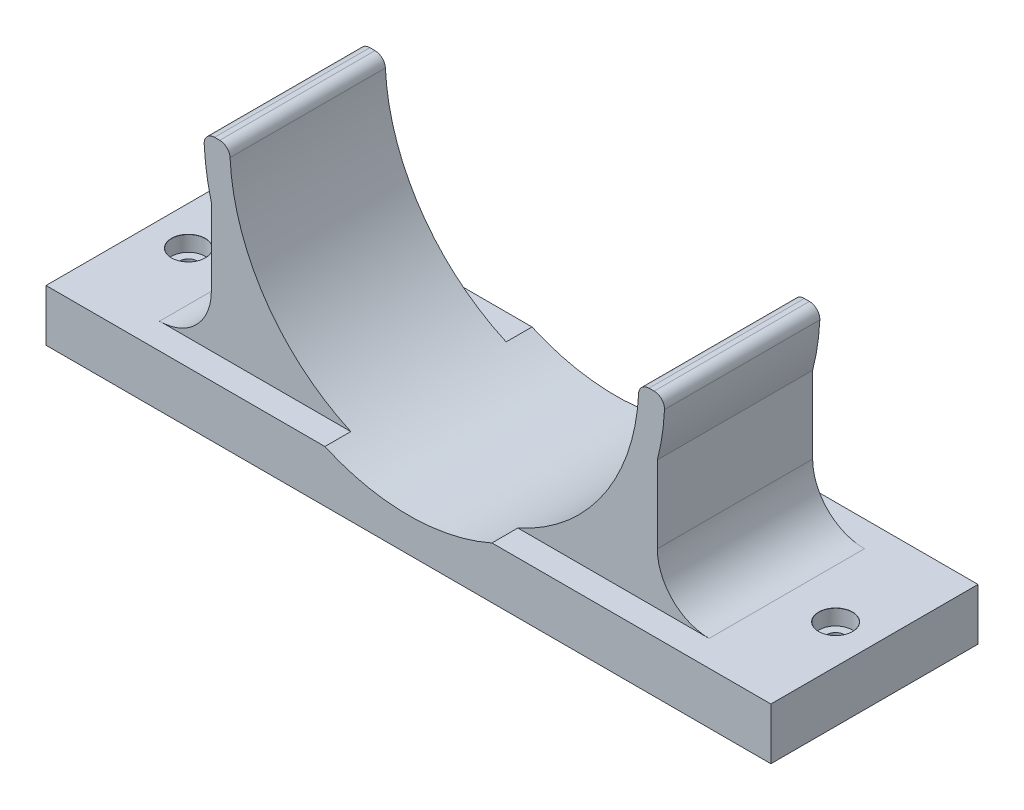
ISO-10303-21;
HEADER;
FILE_DESCRIPTION(('STEP AP214'),'2;1');
FILE_NAME('part.step','',(''),(''),'','','');
FILE_SCHEMA(('AUTOMOTIVE_DESIGN { 1 0 10303 214 1 1 1 1 }'));
ENDSEC;
DATA;
#1=APPLICATION_CONTEXT('core data for automotive mechanical design processes');
#2=APPLICATION_PROTOCOL_DEFINITION('international standard','automotive_design',2000,#1);
#3=PRODUCT_CONTEXT('',#1,'mechanical');
#4=PRODUCT('Part','Part','',(#3));
#5=PRODUCT_RELATED_PRODUCT_CATEGORY('part','',(#4));
#6=PRODUCT_DEFINITION_FORMATION('','',#4);
#7=PRODUCT_DEFINITION_CONTEXT('part definition',#1,'design');
#8=PRODUCT_DEFINITION('design','',#6,#7);
#9=PRODUCT_DEFINITION_SHAPE('','',#8);
#10=(LENGTH_UNIT() NAMED_UNIT(*) SI_UNIT(.MILLI.,.METRE.));
#11=(NAMED_UNIT(*) PLANE_ANGLE_UNIT() SI_UNIT($,.RADIAN.));
#12=(NAMED_UNIT(*) SI_UNIT($,.STERADIAN.) SOLID_ANGLE_UNIT());
#13=UNCERTAINTY_MEASURE_WITH_UNIT(LENGTH_MEASURE(1.E-05),#10,'distance_accuracy_value','');
#14=(GEOMETRIC_REPRESENTATION_CONTEXT(3) GLOBAL_UNCERTAINTY_ASSIGNED_CONTEXT((#13)) GLOBAL_UNIT_ASSIGNED_CONTEXT((#10,
#11,#12)) REPRESENTATION_CONTEXT('',''));
#15=CARTESIAN_POINT('',(0.,0.,0.));
#16=DIRECTION('',(0.,0.,1.));
#17=DIRECTION('',(1.,0.,0.));
#18=AXIS2_PLACEMENT_3D('',#15,#16,#17);
#19=CARTESIAN_POINT('',(0.,-36.056178761089,-20.));
#20=DIRECTION('',(0.,-1.,0.));
#21=DIRECTION('',(0.,0.,-1.));
#22=AXIS2_PLACEMENT_3D('',#19,#20,#21);
#23=PLANE('',#22);
#24=CARTESIAN_POINT('',(-62.5,-36.056178761089,0.));
#25=DIRECTION('',(0.,1.,0.));
#26=DIRECTION('',(0.,0.,1.));
#27=AXIS2_PLACEMENT_3D('',#24,#25,#26);
#28=CIRCLE('',#27,3.275);
#29=CARTESIAN_POINT('',(-62.5,-36.056178761089,3.275));
#30=VERTEX_POINT('',#29);
#31=EDGE_CURVE('E858',#30,#30,#28,.T.);
#32=ORIENTED_EDGE('',*,*,#31,.F.);
#33=EDGE_LOOP('',(#32));
#34=FACE_BOUND('',#33,.T.);
#35=DIRECTION('',(1.,0.,0.));
#36=VECTOR('',#35,1.);
#37=CARTESIAN_POINT('',(0.,-36.056178761089,15.));
#38=LINE('',#37,#36);
#39=CARTESIAN_POINT('',(-53.0653886011214,-36.056178761089,15.));
#40=VERTEX_POINT('',#39);
#41=CARTESIAN_POINT('',(-16.1307772022429,-36.056178761089,15.));
#42=VERTEX_POINT('',#41);
#43=EDGE_CURVE('E209',#40,#42,#38,.T.);
#44=ORIENTED_EDGE('',*,*,#43,.F.);
#45=DIRECTION('',(0.,0.,1.));
#46=VECTOR('',#45,1.);
#47=CARTESIAN_POINT('',(-53.0653886011214,-36.056178761089,-15.));
#48=LINE('',#47,#46);
#49=CARTESIAN_POINT('',(-53.0653886011214,-36.056178761089,-15.));
#50=VERTEX_POINT('',#49);
#51=EDGE_CURVE('E366',#40,#50,#48,.F.);
#52=ORIENTED_EDGE('',*,*,#51,.T.);
#53=DIRECTION('',(1.,0.,0.));
#54=VECTOR('',#53,1.);
#55=CARTESIAN_POINT('',(0.,-36.056178761089,-15.));
#56=LINE('',#55,#54);
#57=CARTESIAN_POINT('',(-16.1307772022429,-36.056178761089,-15.));
#58=VERTEX_POINT('',#57);
#59=EDGE_CURVE('E284',#50,#58,#56,.T.);
#60=ORIENTED_EDGE('',*,*,#59,.T.);
#61=DIRECTION('',(0.,0.,1.));
#62=VECTOR('',#61,1.);
#63=CARTESIAN_POINT('',(-16.1307772022429,-36.056178761089,-20.));
#64=LINE('',#63,#62);
#65=CARTESIAN_POINT('',(-16.1307772022429,-36.056178761089,-20.));
#66=VERTEX_POINT('',#65);
#67=EDGE_CURVE('E354',#66,#58,#64,.T.);
#68=ORIENTED_EDGE('',*,*,#67,.F.);
#69=DIRECTION('',(1.,0.,0.));
#70=VECTOR('',#69,1.);
#71=CARTESIAN_POINT('',(0.,-36.056178761089,-20.));
#72=LINE('',#71,#70);
#73=CARTESIAN_POINT('',(-70.,-36.056178761089,-20.));
#74=VERTEX_POINT('',#73);
#75=EDGE_CURVE('E319',#74,#66,#72,.T.);
#76=ORIENTED_EDGE('',*,*,#75,.F.);
#77=DIRECTION('',(0.,0.,1.));
#78=VECTOR('',#77,1.);
#79=CARTESIAN_POINT('',(-70.,-36.056178761089,-20.));
#80=LINE('',#79,#78);
#81=CARTESIAN_POINT('',(-70.,-36.056178761089,20.));
#82=VERTEX_POINT('',#81);
#83=EDGE_CURVE('E351',#74,#82,#80,.T.);
#84=ORIENTED_EDGE('',*,*,#83,.T.);
#85=DIRECTION('',(1.,0.,0.));
#86=VECTOR('',#85,1.);
#87=CARTESIAN_POINT('',(0.,-36.056178761089,20.));
#88=LINE('',#87,#86);
#89=CARTESIAN_POINT('',(-16.1307772022429,-36.056178761089,20.));
#90=VERTEX_POINT('',#89);
#91=EDGE_CURVE('E295',#82,#90,#88,.T.);
#92=ORIENTED_EDGE('',*,*,#91,.T.);
#93=EDGE_CURVE('E336',#42,#90,#64,.T.);
#94=ORIENTED_EDGE('',*,*,#93,.F.);
#95=EDGE_LOOP('',(#44,#52,#60,#68,#76,#84,#92,#94));
#96=FACE_BOUND('',#95,.T.);
#97=ADVANCED_FACE('F47',(#34,#96),#23,.F.);
#98=CARTESIAN_POINT('',(0.,0.,-15.));
#99=DIRECTION('',(0.,0.,1.));
#100=DIRECTION('',(1.,0.,0.));
#101=AXIS2_PLACEMENT_3D('',#98,#99,#100);
#102=CYLINDRICAL_SURFACE('',#101,44.5);
#103=CARTESIAN_POINT('',(0.,0.,15.));
#104=DIRECTION('',(0.,0.,1.));
#105=DIRECTION('',(1.,0.,0.));
#106=AXIS2_PLACEMENT_3D('',#103,#104,#105);
#107=CIRCLE('',#106,44.5);
#108=CARTESIAN_POINT('',(-44.4506993339844,-2.09411764705882,15.));
#109=VERTEX_POINT('',#108);
#110=CARTESIAN_POINT('',(-43.0653886011214,-11.2081356448965,15.));
#111=VERTEX_POINT('',#110);
#112=EDGE_CURVE('E198',#109,#111,#107,.T.);
#113=ORIENTED_EDGE('',*,*,#112,.F.);
#114=DIRECTION('',(0.,0.,1.));
#115=VECTOR('',#114,1.);
#116=CARTESIAN_POINT('',(-44.4506993339844,-2.09411764705882,-15.));
#117=LINE('',#116,#115);
#118=CARTESIAN_POINT('',(-44.4506993339844,-2.09411764705882,-15.));
#119=VERTEX_POINT('',#118);
#120=EDGE_CURVE('E395',#109,#119,#117,.F.);
#121=ORIENTED_EDGE('',*,*,#120,.T.);
#122=CARTESIAN_POINT('',(0.,0.,-15.));
#123=DIRECTION('',(0.,0.,1.));
#124=DIRECTION('',(1.,0.,0.));
#125=AXIS2_PLACEMENT_3D('',#122,#123,#124);
#126=CIRCLE('',#125,44.5);
#127=CARTESIAN_POINT('',(-43.0653886011214,-11.2081356448965,-15.));
#128=VERTEX_POINT('',#127);
#129=EDGE_CURVE('E226',#119,#128,#126,.T.);
#130=ORIENTED_EDGE('',*,*,#129,.T.);
#131=DIRECTION('',(0.,0.,1.));
#132=VECTOR('',#131,1.);
#133=CARTESIAN_POINT('',(-43.0653886011214,-11.2081356448965,-15.));
#134=LINE('',#133,#132);
#135=EDGE_CURVE('E217',#128,#111,#134,.T.);
#136=ORIENTED_EDGE('',*,*,#135,.T.);
#137=EDGE_LOOP('',(#113,#121,#130,#136));
#138=FACE_BOUND('',#137,.T.);
#139=ADVANCED_FACE('F224',(#138),#102,.T.);
#140=CARTESIAN_POINT('',(0.,-36.056178761089,-20.));
#141=DIRECTION('',(0.,-1.,0.));
#142=DIRECTION('',(0.,0.,-1.));
#143=AXIS2_PLACEMENT_3D('',#140,#141,#142);
#144=PLANE('',#143);
#145=CARTESIAN_POINT('',(62.5,-36.056178761089,0.));
#146=DIRECTION('',(0.,1.,0.));
#147=DIRECTION('',(0.,0.,1.));
#148=AXIS2_PLACEMENT_3D('',#145,#146,#147);
#149=CIRCLE('',#148,3.275);
#150=CARTESIAN_POINT('',(62.5,-36.056178761089,3.275));
#151=VERTEX_POINT('',#150);
#152=EDGE_CURVE('E816',#151,#151,#149,.T.);
#153=ORIENTED_EDGE('',*,*,#152,.F.);
#154=EDGE_LOOP('',(#153));
#155=FACE_BOUND('',#154,.T.);
#156=DIRECTION('',(0.,0.,1.));
#157=VECTOR('',#156,1.);
#158=CARTESIAN_POINT('',(53.0653886011214,-36.056178761089,-20.));
#159=LINE('',#158,#157);
#160=CARTESIAN_POINT('',(53.0653886011214,-36.056178761089,-15.));
#161=VERTEX_POINT('',#160);
#162=CARTESIAN_POINT('',(53.0653886011214,-36.056178761089,15.));
#163=VERTEX_POINT('',#162);
#164=EDGE_CURVE('E340',#161,#163,#159,.T.);
#165=ORIENTED_EDGE('',*,*,#164,.T.);
#166=DIRECTION('',(1.,0.,0.));
#167=VECTOR('',#166,1.);
#168=CARTESIAN_POINT('',(0.,-36.056178761089,15.));
#169=LINE('',#168,#167);
#170=CARTESIAN_POINT('',(16.1307772022429,-36.056178761089,15.));
#171=VERTEX_POINT('',#170);
#172=EDGE_CURVE('E256',#171,#163,#169,.T.);
#173=ORIENTED_EDGE('',*,*,#172,.F.);
#174=DIRECTION('',(0.,0.,1.));
#175=VECTOR('',#174,1.);
#176=CARTESIAN_POINT('',(16.1307772022429,-36.056178761089,-20.));
#177=LINE('',#176,#175);
#178=CARTESIAN_POINT('',(16.1307772022429,-36.056178761089,20.));
#179=VERTEX_POINT('',#178);
#180=EDGE_CURVE('E341',#171,#179,#177,.T.);
#181=ORIENTED_EDGE('',*,*,#180,.T.);
#182=DIRECTION('',(1.,0.,0.));
#183=VECTOR('',#182,1.);
#184=CARTESIAN_POINT('',(0.,-36.056178761089,20.));
#185=LINE('',#184,#183);
#186=CARTESIAN_POINT('',(70.,-36.056178761089,20.));
#187=VERTEX_POINT('',#186);
#188=EDGE_CURVE('E311',#179,#187,#185,.T.);
#189=ORIENTED_EDGE('',*,*,#188,.T.);
#190=DIRECTION('',(0.,0.,1.));
#191=VECTOR('',#190,1.);
#192=CARTESIAN_POINT('',(70.,-36.056178761089,-20.));
#193=LINE('',#192,#191);
#194=CARTESIAN_POINT('',(70.,-36.056178761089,-20.));
#195=VERTEX_POINT('',#194);
#196=EDGE_CURVE('E342',#195,#187,#193,.T.);
#197=ORIENTED_EDGE('',*,*,#196,.F.);
#198=DIRECTION('',(1.,0.,0.));
#199=VECTOR('',#198,1.);
#200=CARTESIAN_POINT('',(0.,-36.056178761089,-20.));
#201=LINE('',#200,#199);
#202=CARTESIAN_POINT('',(16.1307772022429,-36.056178761089,-20.));
#203=VERTEX_POINT('',#202);
#204=EDGE_CURVE('E333',#203,#195,#201,.T.);
#205=ORIENTED_EDGE('',*,*,#204,.F.);
#206=CARTESIAN_POINT('',(16.1307772022429,-36.056178761089,-15.));
#207=VERTEX_POINT('',#206);
#208=EDGE_CURVE('E337',#203,#207,#177,.T.);
#209=ORIENTED_EDGE('',*,*,#208,.T.);
#210=DIRECTION('',(1.,0.,0.));
#211=VECTOR('',#210,1.);
#212=CARTESIAN_POINT('',(0.,-36.056178761089,-15.));
#213=LINE('',#212,#211);
#214=EDGE_CURVE('E243',#207,#161,#213,.T.);
#215=ORIENTED_EDGE('',*,*,#214,.T.);
#216=EDGE_LOOP('',(#165,#173,#181,#189,#197,#205,#209,#215));
#217=FACE_BOUND('',#216,.T.);
#218=ADVANCED_FACE('F461',(#155,#217),#144,.F.);
#219=CARTESIAN_POINT('',(0.,0.,-20.));
#220=DIRECTION('',(0.,0.,1.));
#221=DIRECTION('',(1.,0.,0.));
#222=AXIS2_PLACEMENT_3D('',#219,#220,#221);
#223=CYLINDRICAL_SURFACE('',#222,39.5);
#224=CARTESIAN_POINT('',(0.,0.,-15.));
#225=DIRECTION('',(0.,0.,1.));
#226=DIRECTION('',(1.,0.,0.));
#227=AXIS2_PLACEMENT_3D('',#224,#225,#226);
#228=CIRCLE('',#227,39.5);
#229=CARTESIAN_POINT('',(-39.45410310723,-1.90361445783133,-15.));
#230=VERTEX_POINT('',#229);
#231=EDGE_CURVE('E288',#230,#58,#228,.T.);
#232=ORIENTED_EDGE('',*,*,#231,.F.);
#233=DIRECTION('',(0.,0.,1.));
#234=VECTOR('',#233,1.);
#235=CARTESIAN_POINT('',(-39.45410310723,-1.90361445783133,-20.));
#236=LINE('',#235,#234);
#237=CARTESIAN_POINT('',(-39.45410310723,-1.90361445783133,15.));
#238=VERTEX_POINT('',#237);
#239=EDGE_CURVE('E408',#230,#238,#236,.T.);
#240=ORIENTED_EDGE('',*,*,#239,.T.);
#241=CARTESIAN_POINT('',(0.,0.,15.));
#242=DIRECTION('',(0.,0.,1.));
#243=DIRECTION('',(1.,0.,0.));
#244=AXIS2_PLACEMENT_3D('',#241,#242,#243);
#245=CIRCLE('',#244,39.5);
#246=EDGE_CURVE('E275',#238,#42,#245,.T.);
#247=ORIENTED_EDGE('',*,*,#246,.T.);
#248=ORIENTED_EDGE('',*,*,#93,.T.);
#249=CARTESIAN_POINT('',(0.,0.,20.));
#250=DIRECTION('',(0.,0.,1.));
#251=DIRECTION('',(1.,0.,0.));
#252=AXIS2_PLACEMENT_3D('',#249,#250,#251);
#253=CIRCLE('',#252,39.5);
#254=EDGE_CURVE('E291',#90,#179,#253,.T.);
#255=ORIENTED_EDGE('',*,*,#254,.T.);
#256=ORIENTED_EDGE('',*,*,#180,.F.);
#257=CARTESIAN_POINT('',(0.,0.,15.));
#258=DIRECTION('',(0.,0.,1.));
#259=DIRECTION('',(1.,0.,0.));
#260=AXIS2_PLACEMENT_3D('',#257,#258,#259);
#261=CIRCLE('',#260,39.5);
#262=CARTESIAN_POINT('',(39.45410310723,-1.90361445783133,15.));
#263=VERTEX_POINT('',#262);
#264=EDGE_CURVE('E266',#171,#263,#261,.T.);
#265=ORIENTED_EDGE('',*,*,#264,.T.);
#266=DIRECTION('',(0.,0.,1.));
#267=VECTOR('',#266,1.);
#268=CARTESIAN_POINT('',(39.45410310723,-1.90361445783133,-20.));
#269=LINE('',#268,#267);
#270=CARTESIAN_POINT('',(39.45410310723,-1.90361445783133,-15.));
#271=VERTEX_POINT('',#270);
#272=EDGE_CURVE('E404',#263,#271,#269,.F.);
#273=ORIENTED_EDGE('',*,*,#272,.T.);
#274=CARTESIAN_POINT('',(0.,0.,-15.));
#275=DIRECTION('',(0.,0.,1.));
#276=DIRECTION('',(1.,0.,0.));
#277=AXIS2_PLACEMENT_3D('',#274,#275,#276);
#278=CIRCLE('',#277,39.5);
#279=EDGE_CURVE('E252',#207,#271,#278,.T.);
#280=ORIENTED_EDGE('',*,*,#279,.F.);
#281=ORIENTED_EDGE('',*,*,#208,.F.);
#282=CARTESIAN_POINT('',(0.,0.,-20.));
#283=DIRECTION('',(0.,0.,1.));
#284=DIRECTION('',(1.,0.,0.));
#285=AXIS2_PLACEMENT_3D('',#282,#283,#284);
#286=CIRCLE('',#285,39.5);
#287=EDGE_CURVE('E315',#66,#203,#286,.T.);
#288=ORIENTED_EDGE('',*,*,#287,.F.);
#289=ORIENTED_EDGE('',*,*,#67,.T.);
#290=EDGE_LOOP('',(#232,#240,#247,#248,#255,#256,#265,#273,#280,#281,#288,#289));
#291=FACE_BOUND('',#290,.T.);
#292=ADVANCED_FACE('F437',(#291),#223,.F.);
#293=CARTESIAN_POINT('',(70.,0.,-20.));
#294=DIRECTION('',(-1.,0.,0.));
#295=DIRECTION('',(0.,0.,1.));
#296=AXIS2_PLACEMENT_3D('',#293,#294,#295);
#297=PLANE('',#296);
#298=ORIENTED_EDGE('',*,*,#196,.T.);
#299=DIRECTION('',(0.,-1.,0.));
#300=VECTOR('',#299,1.);
#301=CARTESIAN_POINT('',(70.,0.,20.));
#302=LINE('',#301,#300);
#303=CARTESIAN_POINT('',(70.,-46.056178761089,20.));
#304=VERTEX_POINT('',#303);
#305=EDGE_CURVE('E307',#187,#304,#302,.T.);
#306=ORIENTED_EDGE('',*,*,#305,.T.);
#307=DIRECTION('',(0.,0.,1.));
#308=VECTOR('',#307,1.);
#309=CARTESIAN_POINT('',(70.,-46.056178761089,-20.));
#310=LINE('',#309,#308);
#311=CARTESIAN_POINT('',(70.,-46.056178761089,-20.));
#312=VERTEX_POINT('',#311);
#313=EDGE_CURVE('E345',#312,#304,#310,.T.);
#314=ORIENTED_EDGE('',*,*,#313,.F.);
#315=DIRECTION('',(0.,-1.,0.));
#316=VECTOR('',#315,1.);
#317=CARTESIAN_POINT('',(70.,0.,-20.));
#318=LINE('',#317,#316);
#319=EDGE_CURVE('E330',#195,#312,#318,.T.);
#320=ORIENTED_EDGE('',*,*,#319,.F.);
#321=EDGE_LOOP('',(#298,#306,#314,#320));
#322=FACE_BOUND('',#321,.T.);
#323=ADVANCED_FACE('F504',(#322),#297,.F.);
#324=CARTESIAN_POINT('',(0.,-46.056178761089,-20.));
#325=DIRECTION('',(0.,-1.,0.));
#326=DIRECTION('',(0.,0.,-1.));
#327=AXIS2_PLACEMENT_3D('',#324,#325,#326);
#328=PLANE('',#327);
#329=CARTESIAN_POINT('',(-62.5,-46.056178761089,0.));
#330=DIRECTION('',(0.,1.,0.));
#331=DIRECTION('',(0.,0.,1.));
#332=AXIS2_PLACEMENT_3D('',#329,#330,#331);
#333=CIRCLE('',#332,1.7);
#334=CARTESIAN_POINT('',(-62.5,-46.056178761089,1.7));
#335=VERTEX_POINT('',#334);
#336=EDGE_CURVE('E820',#335,#335,#333,.T.);
#337=ORIENTED_EDGE('',*,*,#336,.T.);
#338=EDGE_LOOP('',(#337));
#339=FACE_BOUND('',#338,.T.);
#340=CARTESIAN_POINT('',(62.5,-46.056178761089,0.));
#341=DIRECTION('',(0.,1.,0.));
#342=DIRECTION('',(0.,0.,1.));
#343=AXIS2_PLACEMENT_3D('',#340,#341,#342);
#344=CIRCLE('',#343,1.69999999999999);
#345=CARTESIAN_POINT('',(62.5,-46.056178761089,1.69999999999999));
#346=VERTEX_POINT('',#345);
#347=EDGE_CURVE('E222',#346,#346,#344,.T.);
#348=ORIENTED_EDGE('',*,*,#347,.T.);
#349=EDGE_LOOP('',(#348));
#350=FACE_BOUND('',#349,.T.);
#351=ORIENTED_EDGE('',*,*,#313,.T.);
#352=DIRECTION('',(1.,0.,0.));
#353=VECTOR('',#352,1.);
#354=CARTESIAN_POINT('',(0.,-46.056178761089,20.));
#355=LINE('',#354,#353);
#356=CARTESIAN_POINT('',(-70.,-46.056178761089,20.));
#357=VERTEX_POINT('',#356);
#358=EDGE_CURVE('E303',#357,#304,#355,.T.);
#359=ORIENTED_EDGE('',*,*,#358,.F.);
#360=DIRECTION('',(0.,0.,1.));
#361=VECTOR('',#360,1.);
#362=CARTESIAN_POINT('',(-70.,-46.056178761089,-20.));
#363=LINE('',#362,#361);
#364=CARTESIAN_POINT('',(-70.,-46.056178761089,-20.));
#365=VERTEX_POINT('',#364);
#366=EDGE_CURVE('E348',#365,#357,#363,.T.);
#367=ORIENTED_EDGE('',*,*,#366,.F.);
#368=DIRECTION('',(1.,0.,0.));
#369=VECTOR('',#368,1.);
#370=CARTESIAN_POINT('',(0.,-46.056178761089,-20.));
#371=LINE('',#370,#369);
#372=EDGE_CURVE('E326',#365,#312,#371,.T.);
#373=ORIENTED_EDGE('',*,*,#372,.T.);
#374=EDGE_LOOP('',(#351,#359,#367,#373));
#375=FACE_BOUND('',#374,.T.);
#376=ADVANCED_FACE('F510',(#339,#350,#375),#328,.T.);
#377=CARTESIAN_POINT('',(-70.,0.,-20.));
#378=DIRECTION('',(-1.,0.,0.));
#379=DIRECTION('',(0.,0.,1.));
#380=AXIS2_PLACEMENT_3D('',#377,#378,#379);
#381=PLANE('',#380);
#382=ORIENTED_EDGE('',*,*,#366,.T.);
#383=DIRECTION('',(0.,-1.,0.));
#384=VECTOR('',#383,1.);
#385=CARTESIAN_POINT('',(-70.,0.,20.));
#386=LINE('',#385,#384);
#387=EDGE_CURVE('E299',#82,#357,#386,.T.);
#388=ORIENTED_EDGE('',*,*,#387,.F.);
#389=ORIENTED_EDGE('',*,*,#83,.F.);
#390=DIRECTION('',(0.,-1.,0.));
#391=VECTOR('',#390,1.);
#392=CARTESIAN_POINT('',(-70.,0.,-20.));
#393=LINE('',#392,#391);
#394=EDGE_CURVE('E322',#74,#365,#393,.T.);
#395=ORIENTED_EDGE('',*,*,#394,.T.);
#396=EDGE_LOOP('',(#382,#388,#389,#395));
#397=FACE_BOUND('',#396,.T.);
#398=ADVANCED_FACE('F508',(#397),#381,.T.);
#399=CARTESIAN_POINT('',(0.,0.,-20.));
#400=DIRECTION('',(0.,0.,1.));
#401=DIRECTION('',(1.,0.,0.));
#402=AXIS2_PLACEMENT_3D('',#399,#400,#401);
#403=PLANE('',#402);
#404=ORIENTED_EDGE('',*,*,#287,.T.);
#405=ORIENTED_EDGE('',*,*,#204,.T.);
#406=ORIENTED_EDGE('',*,*,#319,.T.);
#407=ORIENTED_EDGE('',*,*,#372,.F.);
#408=ORIENTED_EDGE('',*,*,#394,.F.);
#409=ORIENTED_EDGE('',*,*,#75,.T.);
#410=EDGE_LOOP('',(#404,#405,#406,#407,#408,#409));
#411=FACE_BOUND('',#410,.T.);
#412=ADVANCED_FACE('F467',(#411),#403,.F.);
#413=CARTESIAN_POINT('',(0.,0.,20.));
#414=DIRECTION('',(0.,0.,1.));
#415=DIRECTION('',(1.,0.,0.));
#416=AXIS2_PLACEMENT_3D('',#413,#414,#415);
#417=PLANE('',#416);
#418=ORIENTED_EDGE('',*,*,#254,.F.);
#419=ORIENTED_EDGE('',*,*,#91,.F.);
#420=ORIENTED_EDGE('',*,*,#387,.T.);
#421=ORIENTED_EDGE('',*,*,#358,.T.);
#422=ORIENTED_EDGE('',*,*,#305,.F.);
#423=ORIENTED_EDGE('',*,*,#188,.F.);
#424=EDGE_LOOP('',(#418,#419,#420,#421,#422,#423));
#425=FACE_BOUND('',#424,.T.);
#426=ADVANCED_FACE('F500',(#425),#417,.T.);
#427=CARTESIAN_POINT('',(0.,0.,-15.));
#428=DIRECTION('',(0.,1.,0.));
#429=DIRECTION('',(0.,0.,1.));
#430=AXIS2_PLACEMENT_3D('',#427,#428,#429);
#431=PLANE('',#430);
#432=DIRECTION('',(-1.,0.,0.));
#433=VECTOR('',#432,1.);
#434=CARTESIAN_POINT('',(0.,0.,-15.));
#435=LINE('',#434,#433);
#436=CARTESIAN_POINT('',(-41.4517792139252,0.,-15.));
#437=VERTEX_POINT('',#436);
#438=CARTESIAN_POINT('',(-42.4529150942547,0.,-15.));
#439=VERTEX_POINT('',#438);
#440=EDGE_CURVE('E278',#437,#439,#435,.T.);
#441=ORIENTED_EDGE('',*,*,#440,.T.);
#442=DIRECTION('',(0.,0.,1.));
#443=VECTOR('',#442,1.);
#444=CARTESIAN_POINT('',(-42.4529150942547,0.,-15.));
#445=LINE('',#444,#443);
#446=CARTESIAN_POINT('',(-42.4529150942547,0.,15.));
#447=VERTEX_POINT('',#446);
#448=EDGE_CURVE('E386',#439,#447,#445,.T.);
#449=ORIENTED_EDGE('',*,*,#448,.T.);
#450=DIRECTION('',(-1.,0.,0.));
#451=VECTOR('',#450,1.);
#452=CARTESIAN_POINT('',(0.,0.,15.));
#453=LINE('',#452,#451);
#454=CARTESIAN_POINT('',(-41.4517792139252,0.,15.));
#455=VERTEX_POINT('',#454);
#456=EDGE_CURVE('E210',#455,#447,#453,.T.);
#457=ORIENTED_EDGE('',*,*,#456,.F.);
#458=DIRECTION('',(0.,0.,-1.));
#459=VECTOR('',#458,1.);
#460=CARTESIAN_POINT('',(-41.4517792139252,0.,-15.));
#461=LINE('',#460,#459);
#462=EDGE_CURVE('E383',#455,#437,#461,.T.);
#463=ORIENTED_EDGE('',*,*,#462,.T.);
#464=EDGE_LOOP('',(#441,#449,#457,#463));
#465=FACE_BOUND('',#464,.T.);
#466=ADVANCED_FACE('F485',(#465),#431,.T.);
#467=CARTESIAN_POINT('',(0.,0.,-15.));
#468=DIRECTION('',(0.,0.,1.));
#469=DIRECTION('',(1.,0.,0.));
#470=AXIS2_PLACEMENT_3D('',#467,#468,#469);
#471=PLANE('',#470);
#472=ORIENTED_EDGE('',*,*,#129,.F.);
#473=CARTESIAN_POINT('',(-42.4529150942547,-2.,-15.));
#474=DIRECTION('',(0.,0.,1.));
#475=DIRECTION('',(1.,0.,0.));
#476=AXIS2_PLACEMENT_3D('',#473,#474,#475);
#477=CIRCLE('',#476,2.);
#478=EDGE_CURVE('E401',#119,#439,#477,.F.);
#479=ORIENTED_EDGE('',*,*,#478,.T.);
#480=ORIENTED_EDGE('',*,*,#440,.F.);
#481=CARTESIAN_POINT('',(-41.4517792139252,-2.,-15.));
#482=DIRECTION('',(0.,0.,1.));
#483=DIRECTION('',(1.,0.,0.));
#484=AXIS2_PLACEMENT_3D('',#481,#482,#483);
#485=CIRCLE('',#484,2.);
#486=EDGE_CURVE('E398',#437,#230,#485,.F.);
#487=ORIENTED_EDGE('',*,*,#486,.T.);
#488=ORIENTED_EDGE('',*,*,#231,.T.);
#489=ORIENTED_EDGE('',*,*,#59,.F.);
#490=CARTESIAN_POINT('',(-53.0653886011214,-26.0561787610889,-15.));
#491=DIRECTION('',(0.,0.,1.));
#492=DIRECTION('',(1.,0.,0.));
#493=AXIS2_PLACEMENT_3D('',#490,#491,#492);
#494=CIRCLE('',#493,10.);
#495=CARTESIAN_POINT('',(-43.0653886011214,-26.0561787610889,-15.));
#496=VERTEX_POINT('',#495);
#497=EDGE_CURVE('E380',#50,#496,#494,.T.);
#498=ORIENTED_EDGE('',*,*,#497,.T.);
#499=DIRECTION('',(0.,1.,0.));
#500=VECTOR('',#499,1.);
#501=CARTESIAN_POINT('',(-43.0653886011214,0.,-15.));
#502=LINE('',#501,#500);
#503=EDGE_CURVE('E221',#496,#128,#502,.T.);
#504=ORIENTED_EDGE('',*,*,#503,.T.);
#505=EDGE_LOOP('',(#472,#479,#480,#487,#488,#489,#498,#504));
#506=FACE_BOUND('',#505,.T.);
#507=ADVANCED_FACE('F475',(#506),#471,.F.);
#508=CARTESIAN_POINT('',(0.,0.,15.));
#509=DIRECTION('',(0.,0.,1.));
#510=DIRECTION('',(1.,0.,0.));
#511=AXIS2_PLACEMENT_3D('',#508,#509,#510);
#512=PLANE('',#511);
#513=ORIENTED_EDGE('',*,*,#456,.T.);
#514=CARTESIAN_POINT('',(-42.4529150942547,-2.,15.));
#515=DIRECTION('',(0.,0.,1.));
#516=DIRECTION('',(1.,0.,0.));
#517=AXIS2_PLACEMENT_3D('',#514,#515,#516);
#518=CIRCLE('',#517,2.);
#519=EDGE_CURVE('E204',#447,#109,#518,.T.);
#520=ORIENTED_EDGE('',*,*,#519,.T.);
#521=ORIENTED_EDGE('',*,*,#112,.T.);
#522=DIRECTION('',(0.,1.,0.));
#523=VECTOR('',#522,1.);
#524=CARTESIAN_POINT('',(-43.0653886011214,0.,15.));
#525=LINE('',#524,#523);
#526=CARTESIAN_POINT('',(-43.0653886011214,-26.0561787610889,15.));
#527=VERTEX_POINT('',#526);
#528=EDGE_CURVE('E203',#527,#111,#525,.T.);
#529=ORIENTED_EDGE('',*,*,#528,.F.);
#530=CARTESIAN_POINT('',(-53.0653886011214,-26.0561787610889,15.));
#531=DIRECTION('',(0.,0.,1.));
#532=DIRECTION('',(1.,0.,0.));
#533=AXIS2_PLACEMENT_3D('',#530,#531,#532);
#534=CIRCLE('',#533,10.);
#535=EDGE_CURVE('E377',#527,#40,#534,.F.);
#536=ORIENTED_EDGE('',*,*,#535,.T.);
#537=ORIENTED_EDGE('',*,*,#43,.T.);
#538=ORIENTED_EDGE('',*,*,#246,.F.);
#539=CARTESIAN_POINT('',(-41.4517792139252,-2.,15.));
#540=DIRECTION('',(0.,0.,1.));
#541=DIRECTION('',(1.,0.,0.));
#542=AXIS2_PLACEMENT_3D('',#539,#540,#541);
#543=CIRCLE('',#542,2.);
#544=EDGE_CURVE('E390',#238,#455,#543,.T.);
#545=ORIENTED_EDGE('',*,*,#544,.T.);
#546=EDGE_LOOP('',(#513,#520,#521,#529,#536,#537,#538,#545));
#547=FACE_BOUND('',#546,.T.);
#548=ADVANCED_FACE('F201',(#547),#512,.T.);
#549=CARTESIAN_POINT('',(0.,0.,15.));
#550=DIRECTION('',(0.,0.,-1.));
#551=DIRECTION('',(-1.,0.,0.));
#552=AXIS2_PLACEMENT_3D('',#549,#550,#551);
#553=CYLINDRICAL_SURFACE('',#552,44.5);
#554=CARTESIAN_POINT('',(0.,0.,-15.));
#555=DIRECTION('',(0.,0.,1.));
#556=DIRECTION('',(1.,0.,0.));
#557=AXIS2_PLACEMENT_3D('',#554,#555,#556);
#558=CIRCLE('',#557,44.5);
#559=CARTESIAN_POINT('',(43.0653886011214,-11.2081356448965,-15.));
#560=VERTEX_POINT('',#559);
#561=CARTESIAN_POINT('',(44.4506993339844,-2.09411764705882,-15.));
#562=VERTEX_POINT('',#561);
#563=EDGE_CURVE('E246',#560,#562,#558,.T.);
#564=ORIENTED_EDGE('',*,*,#563,.T.);
#565=DIRECTION('',(0.,0.,-1.));
#566=VECTOR('',#565,1.);
#567=CARTESIAN_POINT('',(44.4506993339844,-2.09411764705882,15.));
#568=LINE('',#567,#566);
#569=CARTESIAN_POINT('',(44.4506993339844,-2.09411764705882,15.));
#570=VERTEX_POINT('',#569);
#571=EDGE_CURVE('E63',#562,#570,#568,.F.);
#572=ORIENTED_EDGE('',*,*,#571,.T.);
#573=CARTESIAN_POINT('',(0.,0.,15.));
#574=DIRECTION('',(0.,0.,1.));
#575=DIRECTION('',(1.,0.,0.));
#576=AXIS2_PLACEMENT_3D('',#573,#574,#575);
#577=CIRCLE('',#576,44.5);
#578=CARTESIAN_POINT('',(43.0653886011214,-11.2081356448965,15.));
#579=VERTEX_POINT('',#578);
#580=EDGE_CURVE('E259',#579,#570,#577,.T.);
#581=ORIENTED_EDGE('',*,*,#580,.F.);
#582=DIRECTION('',(0.,0.,1.));
#583=VECTOR('',#582,1.);
#584=CARTESIAN_POINT('',(43.0653886011214,-11.2081356448965,-15.));
#585=LINE('',#584,#583);
#586=EDGE_CURVE('E239',#560,#579,#585,.T.);
#587=ORIENTED_EDGE('',*,*,#586,.F.);
#588=EDGE_LOOP('',(#564,#572,#581,#587));
#589=FACE_BOUND('',#588,.T.);
#590=ADVANCED_FACE('F450',(#589),#553,.T.);
#591=CARTESIAN_POINT('',(0.,0.,15.));
#592=DIRECTION('',(0.,1.,0.));
#593=DIRECTION('',(0.,0.,1.));
#594=AXIS2_PLACEMENT_3D('',#591,#592,#593);
#595=PLANE('',#594);
#596=DIRECTION('',(1.,0.,0.));
#597=VECTOR('',#596,1.);
#598=CARTESIAN_POINT('',(0.,0.,15.));
#599=LINE('',#598,#597);
#600=CARTESIAN_POINT('',(41.4517792139252,0.,15.));
#601=VERTEX_POINT('',#600);
#602=CARTESIAN_POINT('',(42.4529150942547,0.,15.));
#603=VERTEX_POINT('',#602);
#604=EDGE_CURVE('E262',#601,#603,#599,.T.);
#605=ORIENTED_EDGE('',*,*,#604,.T.);
#606=DIRECTION('',(0.,0.,1.));
#607=VECTOR('',#606,1.);
#608=CARTESIAN_POINT('',(42.4529150942547,0.,-15.));
#609=LINE('',#608,#607);
#610=CARTESIAN_POINT('',(42.4529150942547,0.,-15.));
#611=VERTEX_POINT('',#610);
#612=EDGE_CURVE('E415',#603,#611,#609,.F.);
#613=ORIENTED_EDGE('',*,*,#612,.T.);
#614=DIRECTION('',(1.,0.,0.));
#615=VECTOR('',#614,1.);
#616=CARTESIAN_POINT('',(0.,0.,-15.));
#617=LINE('',#616,#615);
#618=CARTESIAN_POINT('',(41.4517792139252,0.,-15.));
#619=VERTEX_POINT('',#618);
#620=EDGE_CURVE('E249',#619,#611,#617,.T.);
#621=ORIENTED_EDGE('',*,*,#620,.F.);
#622=DIRECTION('',(0.,0.,-1.));
#623=VECTOR('',#622,1.);
#624=CARTESIAN_POINT('',(41.4517792139252,0.,15.));
#625=LINE('',#624,#623);
#626=EDGE_CURVE('E412',#619,#601,#625,.F.);
#627=ORIENTED_EDGE('',*,*,#626,.T.);
#628=EDGE_LOOP('',(#605,#613,#621,#627));
#629=FACE_BOUND('',#628,.T.);
#630=ADVANCED_FACE('F443',(#629),#595,.T.);
#631=CARTESIAN_POINT('',(0.,0.,15.));
#632=DIRECTION('',(0.,0.,1.));
#633=DIRECTION('',(1.,0.,0.));
#634=AXIS2_PLACEMENT_3D('',#631,#632,#633);
#635=PLANE('',#634);
#636=ORIENTED_EDGE('',*,*,#580,.T.);
#637=CARTESIAN_POINT('',(42.4529150942547,-2.,15.));
#638=DIRECTION('',(0.,0.,1.));
#639=DIRECTION('',(1.,0.,0.));
#640=AXIS2_PLACEMENT_3D('',#637,#638,#639);
#641=CIRCLE('',#640,2.);
#642=EDGE_CURVE('E11',#570,#603,#641,.T.);
#643=ORIENTED_EDGE('',*,*,#642,.T.);
#644=ORIENTED_EDGE('',*,*,#604,.F.);
#645=CARTESIAN_POINT('',(41.4517792139252,-2.,15.));
#646=DIRECTION('',(0.,0.,1.));
#647=DIRECTION('',(1.,0.,0.));
#648=AXIS2_PLACEMENT_3D('',#645,#646,#647);
#649=CIRCLE('',#648,2.);
#650=EDGE_CURVE('E56',#601,#263,#649,.T.);
#651=ORIENTED_EDGE('',*,*,#650,.T.);
#652=ORIENTED_EDGE('',*,*,#264,.F.);
#653=ORIENTED_EDGE('',*,*,#172,.T.);
#654=CARTESIAN_POINT('',(53.0653886011214,-26.0561787610889,15.));
#655=DIRECTION('',(0.,0.,1.));
#656=DIRECTION('',(1.,0.,0.));
#657=AXIS2_PLACEMENT_3D('',#654,#655,#656);
#658=CIRCLE('',#657,10.);
#659=CARTESIAN_POINT('',(43.0653886011214,-26.0561787610889,15.));
#660=VERTEX_POINT('',#659);
#661=EDGE_CURVE('E370',#163,#660,#658,.F.);
#662=ORIENTED_EDGE('',*,*,#661,.T.);
#663=DIRECTION('',(0.,1.,0.));
#664=VECTOR('',#663,1.);
#665=CARTESIAN_POINT('',(43.0653886011214,0.,15.));
#666=LINE('',#665,#664);
#667=EDGE_CURVE('E229',#660,#579,#666,.T.);
#668=ORIENTED_EDGE('',*,*,#667,.T.);
#669=EDGE_LOOP('',(#636,#643,#644,#651,#652,#653,#662,#668));
#670=FACE_BOUND('',#669,.T.);
#671=ADVANCED_FACE('F430',(#670),#635,.T.);
#672=CARTESIAN_POINT('',(0.,0.,-15.));
#673=DIRECTION('',(0.,0.,1.));
#674=DIRECTION('',(1.,0.,0.));
#675=AXIS2_PLACEMENT_3D('',#672,#673,#674);
#676=PLANE('',#675);
#677=ORIENTED_EDGE('',*,*,#620,.T.);
#678=CARTESIAN_POINT('',(42.4529150942547,-2.,-15.));
#679=DIRECTION('',(0.,0.,1.));
#680=DIRECTION('',(1.,0.,0.));
#681=AXIS2_PLACEMENT_3D('',#678,#679,#680);
#682=CIRCLE('',#681,2.);
#683=EDGE_CURVE('E71',#611,#562,#682,.F.);
#684=ORIENTED_EDGE('',*,*,#683,.T.);
#685=ORIENTED_EDGE('',*,*,#563,.F.);
#686=DIRECTION('',(0.,1.,0.));
#687=VECTOR('',#686,1.);
#688=CARTESIAN_POINT('',(43.0653886011214,0.,-15.));
#689=LINE('',#688,#687);
#690=CARTESIAN_POINT('',(43.0653886011214,-26.0561787610889,-15.));
#691=VERTEX_POINT('',#690);
#692=EDGE_CURVE('E233',#691,#560,#689,.T.);
#693=ORIENTED_EDGE('',*,*,#692,.F.);
#694=CARTESIAN_POINT('',(53.0653886011214,-26.0561787610889,-15.));
#695=DIRECTION('',(0.,0.,1.));
#696=DIRECTION('',(1.,0.,0.));
#697=AXIS2_PLACEMENT_3D('',#694,#695,#696);
#698=CIRCLE('',#697,10.);
#699=EDGE_CURVE('E373',#691,#161,#698,.T.);
#700=ORIENTED_EDGE('',*,*,#699,.T.);
#701=ORIENTED_EDGE('',*,*,#214,.F.);
#702=ORIENTED_EDGE('',*,*,#279,.T.);
#703=CARTESIAN_POINT('',(41.4517792139252,-2.,-15.));
#704=DIRECTION('',(0.,0.,1.));
#705=DIRECTION('',(1.,0.,0.));
#706=AXIS2_PLACEMENT_3D('',#703,#704,#705);
#707=CIRCLE('',#706,2.);
#708=EDGE_CURVE('E419',#271,#619,#707,.F.);
#709=ORIENTED_EDGE('',*,*,#708,.T.);
#710=EDGE_LOOP('',(#677,#684,#685,#693,#700,#701,#702,#709));
#711=FACE_BOUND('',#710,.T.);
#712=ADVANCED_FACE('F440',(#711),#676,.F.);
#713=CARTESIAN_POINT('',(43.0653886011214,0.,-15.));
#714=DIRECTION('',(1.,0.,0.));
#715=DIRECTION('',(0.,0.,-1.));
#716=AXIS2_PLACEMENT_3D('',#713,#714,#715);
#717=PLANE('',#716);
#718=ORIENTED_EDGE('',*,*,#667,.F.);
#719=DIRECTION('',(0.,0.,1.));
#720=VECTOR('',#719,1.);
#721=CARTESIAN_POINT('',(43.0653886011214,-26.0561787610889,-15.));
#722=LINE('',#721,#720);
#723=EDGE_CURVE('E361',#660,#691,#722,.F.);
#724=ORIENTED_EDGE('',*,*,#723,.T.);
#725=ORIENTED_EDGE('',*,*,#692,.T.);
#726=ORIENTED_EDGE('',*,*,#586,.T.);
#727=EDGE_LOOP('',(#718,#724,#725,#726));
#728=FACE_BOUND('',#727,.T.);
#729=ADVANCED_FACE('F452',(#728),#717,.T.);
#730=CARTESIAN_POINT('',(-43.0653886011214,0.,-15.));
#731=DIRECTION('',(1.,0.,0.));
#732=DIRECTION('',(0.,0.,-1.));
#733=AXIS2_PLACEMENT_3D('',#730,#731,#732);
#734=PLANE('',#733);
#735=ORIENTED_EDGE('',*,*,#503,.F.);
#736=DIRECTION('',(0.,0.,1.));
#737=VECTOR('',#736,1.);
#738=CARTESIAN_POINT('',(-43.0653886011214,-26.0561787610889,15.));
#739=LINE('',#738,#737);
#740=EDGE_CURVE('E219',#496,#527,#739,.T.);
#741=ORIENTED_EDGE('',*,*,#740,.T.);
#742=ORIENTED_EDGE('',*,*,#528,.T.);
#743=ORIENTED_EDGE('',*,*,#135,.F.);
#744=EDGE_LOOP('',(#735,#741,#742,#743));
#745=FACE_BOUND('',#744,.T.);
#746=ADVANCED_FACE('F216',(#745),#734,.F.);
#747=CARTESIAN_POINT('',(53.0653886011214,-26.0561787610889,-20.));
#748=DIRECTION('',(0.,0.,1.));
#749=DIRECTION('',(1.,0.,0.));
#750=AXIS2_PLACEMENT_3D('',#747,#748,#749);
#751=CYLINDRICAL_SURFACE('',#750,10.);
#752=ORIENTED_EDGE('',*,*,#699,.F.);
#753=ORIENTED_EDGE('',*,*,#723,.F.);
#754=ORIENTED_EDGE('',*,*,#661,.F.);
#755=ORIENTED_EDGE('',*,*,#164,.F.);
#756=EDGE_LOOP('',(#752,#753,#754,#755));
#757=FACE_BOUND('',#756,.T.);
#758=ADVANCED_FACE('F458',(#757),#751,.F.);
#759=CARTESIAN_POINT('',(-53.0653886011214,-26.0561787610889,-15.));
#760=DIRECTION('',(0.,0.,-1.));
#761=DIRECTION('',(-1.,0.,0.));
#762=AXIS2_PLACEMENT_3D('',#759,#760,#761);
#763=CYLINDRICAL_SURFACE('',#762,10.);
#764=ORIENTED_EDGE('',*,*,#497,.F.);
#765=ORIENTED_EDGE('',*,*,#51,.F.);
#766=ORIENTED_EDGE('',*,*,#535,.F.);
#767=ORIENTED_EDGE('',*,*,#740,.F.);
#768=EDGE_LOOP('',(#764,#765,#766,#767));
#769=FACE_BOUND('',#768,.T.);
#770=ADVANCED_FACE('F491',(#769),#763,.F.);
#771=CARTESIAN_POINT('',(62.5,-36.056178761089,0.));
#772=DIRECTION('',(0.,1.,0.));
#773=DIRECTION('',(0.,0.,1.));
#774=AXIS2_PLACEMENT_3D('',#771,#772,#773);
#775=CYLINDRICAL_SURFACE('',#774,1.69999999999999);
#776=ORIENTED_EDGE('',*,*,#347,.F.);
#777=EDGE_LOOP('',(#776));
#778=FACE_BOUND('',#777,.T.);
#779=CARTESIAN_POINT('',(62.5,-39.056178761089,0.));
#780=DIRECTION('',(0.,1.,0.));
#781=DIRECTION('',(0.,0.,1.));
#782=AXIS2_PLACEMENT_3D('',#779,#780,#781);
#783=CIRCLE('',#782,1.69999999999999);
#784=CARTESIAN_POINT('',(62.5,-39.056178761089,1.69999999999999));
#785=VERTEX_POINT('',#784);
#786=EDGE_CURVE('E834',#785,#785,#783,.T.);
#787=ORIENTED_EDGE('',*,*,#786,.T.);
#788=EDGE_LOOP('',(#787));
#789=FACE_BOUND('',#788,.T.);
#790=ADVANCED_FACE('F539',(#778,#789),#775,.F.);
#791=CARTESIAN_POINT('',(65.75,-39.056178761089,0.));
#792=DIRECTION('',(0.,-1.,0.));
#793=DIRECTION('',(0.,0.,-1.));
#794=AXIS2_PLACEMENT_3D('',#791,#792,#793);
#795=PLANE('',#794);
#796=ORIENTED_EDGE('',*,*,#786,.F.);
#797=EDGE_LOOP('',(#796));
#798=FACE_BOUND('',#797,.T.);
#799=CARTESIAN_POINT('',(62.5,-39.056178761089,0.));
#800=DIRECTION('',(0.,1.,0.));
#801=DIRECTION('',(0.,0.,1.));
#802=AXIS2_PLACEMENT_3D('',#799,#800,#801);
#803=CIRCLE('',#802,3.25);
#804=CARTESIAN_POINT('',(62.5,-39.056178761089,3.25));
#805=VERTEX_POINT('',#804);
#806=EDGE_CURVE('E825',#805,#805,#803,.T.);
#807=ORIENTED_EDGE('',*,*,#806,.T.);
#808=EDGE_LOOP('',(#807));
#809=FACE_BOUND('',#808,.T.);
#810=ADVANCED_FACE('F627',(#798,#809),#795,.F.);
#811=CARTESIAN_POINT('',(62.5,-36.056178761089,0.));
#812=DIRECTION('',(0.,1.,0.));
#813=DIRECTION('',(0.,0.,1.));
#814=AXIS2_PLACEMENT_3D('',#811,#812,#813);
#815=CYLINDRICAL_SURFACE('',#814,3.25);
#816=ORIENTED_EDGE('',*,*,#806,.F.);
#817=EDGE_LOOP('',(#816));
#818=FACE_BOUND('',#817,.T.);
#819=CARTESIAN_POINT('',(62.5,-36.0811787610889,0.));
#820=DIRECTION('',(0.,1.,0.));
#821=DIRECTION('',(0.,0.,1.));
#822=AXIS2_PLACEMENT_3D('',#819,#820,#821);
#823=CIRCLE('',#822,3.25);
#824=CARTESIAN_POINT('',(62.5,-36.0811787610889,3.25));
#825=VERTEX_POINT('',#824);
#826=EDGE_CURVE('E819',#825,#825,#823,.T.);
#827=ORIENTED_EDGE('',*,*,#826,.T.);
#828=EDGE_LOOP('',(#827));
#829=FACE_BOUND('',#828,.T.);
#830=ADVANCED_FACE('F617',(#818,#829),#815,.F.);
#831=CARTESIAN_POINT('',(62.5,-36.056178761089,0.));
#832=DIRECTION('',(0.,1.,0.));
#833=DIRECTION('',(0.,0.,1.));
#834=AXIS2_PLACEMENT_3D('',#831,#832,#833);
#835=CONICAL_SURFACE('',#834,3.275,0.785398163397448);
#836=ORIENTED_EDGE('',*,*,#826,.F.);
#837=EDGE_LOOP('',(#836));
#838=FACE_BOUND('',#837,.T.);
#839=ORIENTED_EDGE('',*,*,#152,.T.);
#840=EDGE_LOOP('',(#839));
#841=FACE_BOUND('',#840,.T.);
#842=ADVANCED_FACE('F607',(#838,#841),#835,.F.);
#843=CARTESIAN_POINT('',(-62.5,-36.056178761089,0.));
#844=DIRECTION('',(0.,1.,0.));
#845=DIRECTION('',(0.,0.,1.));
#846=AXIS2_PLACEMENT_3D('',#843,#844,#845);
#847=CYLINDRICAL_SURFACE('',#846,1.7);
#848=ORIENTED_EDGE('',*,*,#336,.F.);
#849=EDGE_LOOP('',(#848));
#850=FACE_BOUND('',#849,.T.);
#851=CARTESIAN_POINT('',(-62.5,-39.056178761089,0.));
#852=DIRECTION('',(0.,1.,0.));
#853=DIRECTION('',(0.,0.,1.));
#854=AXIS2_PLACEMENT_3D('',#851,#852,#853);
#855=CIRCLE('',#854,1.7);
#856=CARTESIAN_POINT('',(-62.5,-39.056178761089,1.7));
#857=VERTEX_POINT('',#856);
#858=EDGE_CURVE('E827',#857,#857,#855,.T.);
#859=ORIENTED_EDGE('',*,*,#858,.T.);
#860=EDGE_LOOP('',(#859));
#861=FACE_BOUND('',#860,.T.);
#862=ADVANCED_FACE('F597',(#850,#861),#847,.F.);
#863=CARTESIAN_POINT('',(-59.25,-39.056178761089,0.));
#864=DIRECTION('',(0.,-1.,0.));
#865=DIRECTION('',(0.,0.,-1.));
#866=AXIS2_PLACEMENT_3D('',#863,#864,#865);
#867=PLANE('',#866);
#868=ORIENTED_EDGE('',*,*,#858,.F.);
#869=EDGE_LOOP('',(#868));
#870=FACE_BOUND('',#869,.T.);
#871=CARTESIAN_POINT('',(-62.5,-39.056178761089,0.));
#872=DIRECTION('',(0.,1.,0.));
#873=DIRECTION('',(0.,0.,1.));
#874=AXIS2_PLACEMENT_3D('',#871,#872,#873);
#875=CIRCLE('',#874,3.25);
#876=CARTESIAN_POINT('',(-62.5,-39.056178761089,3.25));
#877=VERTEX_POINT('',#876);
#878=EDGE_CURVE('E850',#877,#877,#875,.T.);
#879=ORIENTED_EDGE('',*,*,#878,.T.);
#880=EDGE_LOOP('',(#879));
#881=FACE_BOUND('',#880,.T.);
#882=ADVANCED_FACE('F587',(#870,#881),#867,.F.);
#883=CARTESIAN_POINT('',(-62.5,-36.056178761089,0.));
#884=DIRECTION('',(0.,1.,0.));
#885=DIRECTION('',(0.,0.,1.));
#886=AXIS2_PLACEMENT_3D('',#883,#884,#885);
#887=CYLINDRICAL_SURFACE('',#886,3.25);
#888=ORIENTED_EDGE('',*,*,#878,.F.);
#889=EDGE_LOOP('',(#888));
#890=FACE_BOUND('',#889,.T.);
#891=CARTESIAN_POINT('',(-62.5,-36.0811787610889,0.));
#892=DIRECTION('',(0.,1.,0.));
#893=DIRECTION('',(0.,0.,1.));
#894=AXIS2_PLACEMENT_3D('',#891,#892,#893);
#895=CIRCLE('',#894,3.25);
#896=CARTESIAN_POINT('',(-62.5,-36.0811787610889,3.25));
#897=VERTEX_POINT('',#896);
#898=EDGE_CURVE('E854',#897,#897,#895,.T.);
#899=ORIENTED_EDGE('',*,*,#898,.T.);
#900=EDGE_LOOP('',(#899));
#901=FACE_BOUND('',#900,.T.);
#902=ADVANCED_FACE('F577',(#890,#901),#887,.F.);
#903=CARTESIAN_POINT('',(-62.5,-36.056178761089,0.));
#904=DIRECTION('',(0.,1.,0.));
#905=DIRECTION('',(0.,0.,1.));
#906=AXIS2_PLACEMENT_3D('',#903,#904,#905);
#907=CONICAL_SURFACE('',#906,3.275,0.785398163397448);
#908=ORIENTED_EDGE('',*,*,#898,.F.);
#909=EDGE_LOOP('',(#908));
#910=FACE_BOUND('',#909,.T.);
#911=ORIENTED_EDGE('',*,*,#31,.T.);
#912=EDGE_LOOP('',(#911));
#913=FACE_BOUND('',#912,.T.);
#914=ADVANCED_FACE('F542',(#910,#913),#907,.F.);
#915=CARTESIAN_POINT('',(-42.4529150942547,-2.,-15.));
#916=DIRECTION('',(0.,0.,1.));
#917=DIRECTION('',(1.,0.,0.));
#918=AXIS2_PLACEMENT_3D('',#915,#916,#917);
#919=CYLINDRICAL_SURFACE('',#918,2.);
#920=ORIENTED_EDGE('',*,*,#478,.F.);
#921=ORIENTED_EDGE('',*,*,#120,.F.);
#922=ORIENTED_EDGE('',*,*,#519,.F.);
#923=ORIENTED_EDGE('',*,*,#448,.F.);
#924=EDGE_LOOP('',(#920,#921,#922,#923));
#925=FACE_BOUND('',#924,.T.);
#926=ADVANCED_FACE('F489',(#925),#919,.T.);
#927=CARTESIAN_POINT('',(-41.4517792139252,-2.,-20.));
#928=DIRECTION('',(0.,0.,1.));
#929=DIRECTION('',(1.,0.,0.));
#930=AXIS2_PLACEMENT_3D('',#927,#928,#929);
#931=CYLINDRICAL_SURFACE('',#930,2.);
#932=ORIENTED_EDGE('',*,*,#486,.F.);
#933=ORIENTED_EDGE('',*,*,#462,.F.);
#934=ORIENTED_EDGE('',*,*,#544,.F.);
#935=ORIENTED_EDGE('',*,*,#239,.F.);
#936=EDGE_LOOP('',(#932,#933,#934,#935));
#937=FACE_BOUND('',#936,.T.);
#938=ADVANCED_FACE('F481',(#937),#931,.T.);
#939=CARTESIAN_POINT('',(42.4529150942547,-2.,15.));
#940=DIRECTION('',(0.,0.,-1.));
#941=DIRECTION('',(-1.,0.,0.));
#942=AXIS2_PLACEMENT_3D('',#939,#940,#941);
#943=CYLINDRICAL_SURFACE('',#942,2.);
#944=ORIENTED_EDGE('',*,*,#642,.F.);
#945=ORIENTED_EDGE('',*,*,#571,.F.);
#946=ORIENTED_EDGE('',*,*,#683,.F.);
#947=ORIENTED_EDGE('',*,*,#612,.F.);
#948=EDGE_LOOP('',(#944,#945,#946,#947));
#949=FACE_BOUND('',#948,.T.);
#950=ADVANCED_FACE('F447',(#949),#943,.T.);
#951=CARTESIAN_POINT('',(41.4517792139252,-2.,-20.));
#952=DIRECTION('',(0.,0.,1.));
#953=DIRECTION('',(1.,0.,0.));
#954=AXIS2_PLACEMENT_3D('',#951,#952,#953);
#955=CYLINDRICAL_SURFACE('',#954,2.);
#956=ORIENTED_EDGE('',*,*,#650,.F.);
#957=ORIENTED_EDGE('',*,*,#626,.F.);
#958=ORIENTED_EDGE('',*,*,#708,.F.);
#959=ORIENTED_EDGE('',*,*,#272,.F.);
#960=EDGE_LOOP('',(#956,#957,#958,#959));
#961=FACE_BOUND('',#960,.T.);
#962=ADVANCED_FACE('F49',(#961),#955,.T.);
#963=CLOSED_SHELL('',(#97,#139,#218,#292,#323,#376,#398,#412,#426,#466,#507,#548,#590,#630,#671,
#712,#729,#746,#758,#770,#790,#810,#830,#842,#862,#882,#902,#914,#926,#938,#950,#962));
#964=MANIFOLD_SOLID_BREP('B2',#963);
#965=ADVANCED_BREP_SHAPE_REPRESENTATION('',(#18,#964),#14);
#966=SHAPE_DEFINITION_REPRESENTATION(#9,#965);
ENDSEC;
END-ISO-10303-21;
